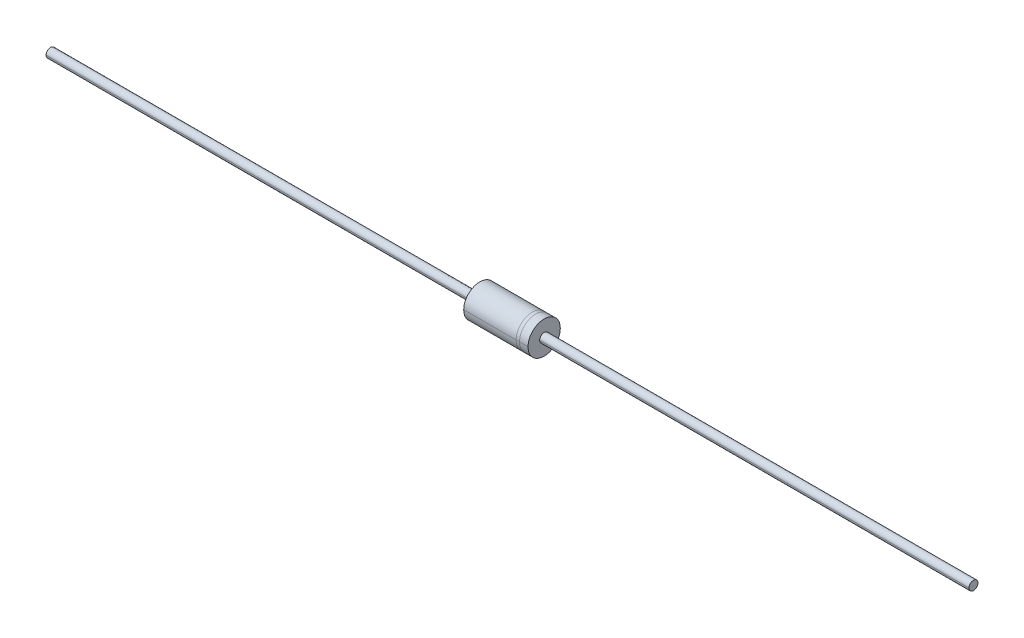
ISO-10303-21;
HEADER;
FILE_DESCRIPTION(('STEP AP214'),'2;1');
FILE_NAME('part.step','',(''),(''),'','','');
FILE_SCHEMA(('AUTOMOTIVE_DESIGN { 1 0 10303 214 1 1 1 1 }'));
ENDSEC;
DATA;
#1=APPLICATION_CONTEXT('core data for automotive mechanical design processes');
#2=APPLICATION_PROTOCOL_DEFINITION('international standard','automotive_design',2000,#1);
#3=PRODUCT_CONTEXT('',#1,'mechanical');
#4=PRODUCT('Part','Part','',(#3));
#5=PRODUCT_RELATED_PRODUCT_CATEGORY('part','',(#4));
#6=PRODUCT_DEFINITION_FORMATION('','',#4);
#7=PRODUCT_DEFINITION_CONTEXT('part definition',#1,'design');
#8=PRODUCT_DEFINITION('design','',#6,#7);
#9=PRODUCT_DEFINITION_SHAPE('','',#8);
#10=(LENGTH_UNIT() NAMED_UNIT(*) SI_UNIT(.MILLI.,.METRE.));
#11=(NAMED_UNIT(*) PLANE_ANGLE_UNIT() SI_UNIT($,.RADIAN.));
#12=(NAMED_UNIT(*) SI_UNIT($,.STERADIAN.) SOLID_ANGLE_UNIT());
#13=UNCERTAINTY_MEASURE_WITH_UNIT(LENGTH_MEASURE(1.E-05),#10,'distance_accuracy_value','');
#14=(GEOMETRIC_REPRESENTATION_CONTEXT(3) GLOBAL_UNCERTAINTY_ASSIGNED_CONTEXT((#13)) GLOBAL_UNIT_ASSIGNED_CONTEXT((#10,
#11,#12)) REPRESENTATION_CONTEXT('',''));
#15=CARTESIAN_POINT('',(0.,0.,0.));
#16=DIRECTION('',(0.,0.,1.));
#17=DIRECTION('',(1.,0.,0.));
#18=AXIS2_PLACEMENT_3D('',#15,#16,#17);
#19=CARTESIAN_POINT('',(1.9025,0.955,0.));
#20=DIRECTION('',(1.,0.,0.));
#21=DIRECTION('',(0.,1.,0.));
#22=AXIS2_PLACEMENT_3D('',#19,#20,#21);
#23=PLANE('',#22);
#24=CARTESIAN_POINT('',(1.9025,0.955,0.));
#25=DIRECTION('',(1.,0.,0.));
#26=DIRECTION('',(0.,0.,-1.));
#27=AXIS2_PLACEMENT_3D('',#24,#25,#26);
#28=CIRCLE('',#27,0.2665);
#29=CARTESIAN_POINT('',(1.9025,0.955,0.2665));
#30=VERTEX_POINT('',#29);
#31=CARTESIAN_POINT('',(1.9025,0.955,-0.2665));
#32=VERTEX_POINT('',#31);
#33=EDGE_CURVE('P0_E11',#30,#32,#28,.T.);
#34=ORIENTED_EDGE('',*,*,#33,.F.);
#35=CARTESIAN_POINT('',(1.9025,0.955,0.));
#36=DIRECTION('',(1.,0.,0.));
#37=DIRECTION('',(0.,0.,-1.));
#38=AXIS2_PLACEMENT_3D('',#35,#36,#37);
#39=CIRCLE('',#38,0.2665);
#40=EDGE_CURVE('P0_E63',#32,#30,#39,.T.);
#41=ORIENTED_EDGE('',*,*,#40,.F.);
#42=EDGE_LOOP('',(#34,#41));
#43=FACE_BOUND('',#42,.T.);
#44=ADVANCED_FACE('P0_F16',(#43),#23,.F.);
#45=CARTESIAN_POINT('',(27.3025,0.955,0.));
#46=DIRECTION('',(1.,0.,0.));
#47=DIRECTION('',(0.,1.,0.));
#48=AXIS2_PLACEMENT_3D('',#45,#46,#47);
#49=PLANE('',#48);
#50=CARTESIAN_POINT('',(27.3025,0.955,0.));
#51=DIRECTION('',(1.,0.,0.));
#52=DIRECTION('',(0.,0.,-1.));
#53=AXIS2_PLACEMENT_3D('',#50,#51,#52);
#54=CIRCLE('',#53,0.2665);
#55=CARTESIAN_POINT('',(27.3025,0.955,0.2665));
#56=VERTEX_POINT('',#55);
#57=CARTESIAN_POINT('',(27.3025,0.955,-0.2665));
#58=VERTEX_POINT('',#57);
#59=EDGE_CURVE('P0_E20',#56,#58,#54,.T.);
#60=ORIENTED_EDGE('',*,*,#59,.T.);
#61=CARTESIAN_POINT('',(27.3025,0.955,0.));
#62=DIRECTION('',(1.,0.,0.));
#63=DIRECTION('',(0.,0.,-1.));
#64=AXIS2_PLACEMENT_3D('',#61,#62,#63);
#65=CIRCLE('',#64,0.2665);
#66=EDGE_CURVE('P0_E54',#58,#56,#65,.T.);
#67=ORIENTED_EDGE('',*,*,#66,.T.);
#68=EDGE_LOOP('',(#60,#67));
#69=FACE_BOUND('',#68,.T.);
#70=ADVANCED_FACE('P0_F18',(#69),#49,.T.);
#71=CARTESIAN_POINT('',(27.3025,0.955,0.));
#72=DIRECTION('',(-1.,0.,0.));
#73=DIRECTION('',(0.,0.,1.));
#74=AXIS2_PLACEMENT_3D('',#71,#72,#73);
#75=CYLINDRICAL_SURFACE('',#74,0.2665);
#76=DIRECTION('',(-1.,0.,0.));
#77=VECTOR('',#76,1.);
#78=CARTESIAN_POINT('',(27.3025,0.955,-0.2665));
#79=LINE('',#78,#77);
#80=EDGE_CURVE('P0_E58',#58,#32,#79,.T.);
#81=ORIENTED_EDGE('',*,*,#80,.F.);
#82=ORIENTED_EDGE('',*,*,#59,.F.);
#83=DIRECTION('',(-1.,0.,0.));
#84=VECTOR('',#83,1.);
#85=CARTESIAN_POINT('',(27.3025,0.955,0.2665));
#86=LINE('',#85,#84);
#87=EDGE_CURVE('P0_E56',#56,#30,#86,.T.);
#88=ORIENTED_EDGE('',*,*,#87,.T.);
#89=ORIENTED_EDGE('',*,*,#33,.T.);
#90=EDGE_LOOP('',(#81,#82,#88,#89));
#91=FACE_BOUND('',#90,.T.);
#92=ADVANCED_FACE('P0_F59',(#91),#75,.T.);
#93=CARTESIAN_POINT('',(27.3025,0.955,0.));
#94=DIRECTION('',(-1.,0.,0.));
#95=DIRECTION('',(0.,0.,1.));
#96=AXIS2_PLACEMENT_3D('',#93,#94,#95);
#97=CYLINDRICAL_SURFACE('',#96,0.2665);
#98=ORIENTED_EDGE('',*,*,#66,.F.);
#99=ORIENTED_EDGE('',*,*,#80,.T.);
#100=ORIENTED_EDGE('',*,*,#40,.T.);
#101=ORIENTED_EDGE('',*,*,#87,.F.);
#102=EDGE_LOOP('',(#98,#99,#100,#101));
#103=FACE_BOUND('',#102,.T.);
#104=ADVANCED_FACE('P0_F65',(#103),#97,.T.);
#105=CLOSED_SHELL('',(#44,#70,#92,#104));
#106=MANIFOLD_SOLID_BREP('P0_B1',#105);
#107=CARTESIAN_POINT('',(-1.9025,0.955,0.));
#108=DIRECTION('',(-1.,0.,0.));
#109=DIRECTION('',(0.,0.,1.));
#110=AXIS2_PLACEMENT_3D('',#107,#108,#109);
#111=PLANE('',#110);
#112=CARTESIAN_POINT('',(-1.9025,0.955,0.));
#113=DIRECTION('',(1.,0.,0.));
#114=DIRECTION('',(0.,0.,-1.));
#115=AXIS2_PLACEMENT_3D('',#112,#113,#114);
#116=CIRCLE('',#115,0.2665);
#117=CARTESIAN_POINT('',(-1.9025,0.955,0.2665));
#118=VERTEX_POINT('',#117);
#119=CARTESIAN_POINT('',(-1.9025,0.955,-0.2665));
#120=VERTEX_POINT('',#119);
#121=EDGE_CURVE('P1_E61',#118,#120,#116,.T.);
#122=ORIENTED_EDGE('',*,*,#121,.T.);
#123=CARTESIAN_POINT('',(-1.9025,0.955,0.));
#124=DIRECTION('',(1.,0.,0.));
#125=DIRECTION('',(0.,0.,-1.));
#126=AXIS2_PLACEMENT_3D('',#123,#124,#125);
#127=CIRCLE('',#126,0.2665);
#128=EDGE_CURVE('P1_E11',#120,#118,#127,.T.);
#129=ORIENTED_EDGE('',*,*,#128,.T.);
#130=EDGE_LOOP('',(#122,#129));
#131=FACE_BOUND('',#130,.T.);
#132=ADVANCED_FACE('P1_F16',(#131),#111,.F.);
#133=CARTESIAN_POINT('',(-27.3025,0.955,0.));
#134=DIRECTION('',(-1.,0.,0.));
#135=DIRECTION('',(0.,0.,1.));
#136=AXIS2_PLACEMENT_3D('',#133,#134,#135);
#137=PLANE('',#136);
#138=CARTESIAN_POINT('',(-27.3025,0.955,0.));
#139=DIRECTION('',(1.,0.,0.));
#140=DIRECTION('',(0.,0.,-1.));
#141=AXIS2_PLACEMENT_3D('',#138,#139,#140);
#142=CIRCLE('',#141,0.2665);
#143=CARTESIAN_POINT('',(-27.3025,0.955,0.2665));
#144=VERTEX_POINT('',#143);
#145=CARTESIAN_POINT('',(-27.3025,0.955,-0.2665));
#146=VERTEX_POINT('',#145);
#147=EDGE_CURVE('P1_E60',#144,#146,#142,.T.);
#148=ORIENTED_EDGE('',*,*,#147,.F.);
#149=CARTESIAN_POINT('',(-27.3025,0.955,0.));
#150=DIRECTION('',(1.,0.,0.));
#151=DIRECTION('',(0.,0.,-1.));
#152=AXIS2_PLACEMENT_3D('',#149,#150,#151);
#153=CIRCLE('',#152,0.2665);
#154=EDGE_CURVE('P1_E26',#146,#144,#153,.T.);
#155=ORIENTED_EDGE('',*,*,#154,.F.);
#156=EDGE_LOOP('',(#148,#155));
#157=FACE_BOUND('',#156,.T.);
#158=ADVANCED_FACE('P1_F63',(#157),#137,.T.);
#159=CARTESIAN_POINT('',(-27.3025,0.955,0.));
#160=DIRECTION('',(1.,0.,0.));
#161=DIRECTION('',(0.,0.,1.));
#162=AXIS2_PLACEMENT_3D('',#159,#160,#161);
#163=CYLINDRICAL_SURFACE('',#162,0.2665);
#164=DIRECTION('',(1.,0.,0.));
#165=VECTOR('',#164,1.);
#166=CARTESIAN_POINT('',(-27.3025,0.955,-0.2665));
#167=LINE('',#166,#165);
#168=EDGE_CURVE('P1_E52',#146,#120,#167,.T.);
#169=ORIENTED_EDGE('',*,*,#168,.F.);
#170=ORIENTED_EDGE('',*,*,#154,.T.);
#171=DIRECTION('',(1.,0.,0.));
#172=VECTOR('',#171,1.);
#173=CARTESIAN_POINT('',(-27.3025,0.955,0.2665));
#174=LINE('',#173,#172);
#175=EDGE_CURVE('P1_E19',#144,#118,#174,.T.);
#176=ORIENTED_EDGE('',*,*,#175,.T.);
#177=ORIENTED_EDGE('',*,*,#128,.F.);
#178=EDGE_LOOP('',(#169,#170,#176,#177));
#179=FACE_BOUND('',#178,.T.);
#180=ADVANCED_FACE('P1_F49',(#179),#163,.T.);
#181=CARTESIAN_POINT('',(-27.3025,0.955,0.));
#182=DIRECTION('',(1.,0.,0.));
#183=DIRECTION('',(0.,0.,1.));
#184=AXIS2_PLACEMENT_3D('',#181,#182,#183);
#185=CYLINDRICAL_SURFACE('',#184,0.2665);
#186=ORIENTED_EDGE('',*,*,#147,.T.);
#187=ORIENTED_EDGE('',*,*,#168,.T.);
#188=ORIENTED_EDGE('',*,*,#121,.F.);
#189=ORIENTED_EDGE('',*,*,#175,.F.);
#190=EDGE_LOOP('',(#186,#187,#188,#189));
#191=FACE_BOUND('',#190,.T.);
#192=ADVANCED_FACE('P1_F59',(#191),#185,.T.);
#193=CLOSED_SHELL('',(#132,#158,#180,#192));
#194=MANIFOLD_SOLID_BREP('P1_B1',#193);
#195=CARTESIAN_POINT('',(1.9025,0.955,0.));
#196=DIRECTION('',(-1.,0.,0.));
#197=DIRECTION('',(0.,0.,1.));
#198=AXIS2_PLACEMENT_3D('',#195,#196,#197);
#199=CYLINDRICAL_SURFACE('',#198,0.955);
#200=DIRECTION('',(-1.,0.,0.));
#201=VECTOR('',#200,1.);
#202=CARTESIAN_POINT('',(1.9025,0.955,-0.955));
#203=LINE('',#202,#201);
#204=CARTESIAN_POINT('',(1.9025,0.955,-0.955));
#205=VERTEX_POINT('',#204);
#206=CARTESIAN_POINT('',(1.4,0.955,-0.955));
#207=VERTEX_POINT('',#206);
#208=EDGE_CURVE('P2_E120',#205,#207,#203,.T.);
#209=ORIENTED_EDGE('',*,*,#208,.F.);
#210=CARTESIAN_POINT('',(1.9025,0.955,0.));
#211=DIRECTION('',(1.,0.,0.));
#212=DIRECTION('',(0.,0.,-1.));
#213=AXIS2_PLACEMENT_3D('',#210,#211,#212);
#214=CIRCLE('',#213,0.955);
#215=CARTESIAN_POINT('',(1.9025,0.955,0.955));
#216=VERTEX_POINT('',#215);
#217=EDGE_CURVE('P2_E11',#216,#205,#214,.T.);
#218=ORIENTED_EDGE('',*,*,#217,.F.);
#219=DIRECTION('',(-1.,0.,0.));
#220=VECTOR('',#219,1.);
#221=CARTESIAN_POINT('',(1.9025,0.955,0.955));
#222=LINE('',#221,#220);
#223=CARTESIAN_POINT('',(1.4,0.955,0.955));
#224=VERTEX_POINT('',#223);
#225=EDGE_CURVE('P2_E126',#216,#224,#222,.T.);
#226=ORIENTED_EDGE('',*,*,#225,.T.);
#227=CARTESIAN_POINT('',(1.4,0.955,0.));
#228=DIRECTION('',(1.,0.,0.));
#229=DIRECTION('',(0.,0.,-1.));
#230=AXIS2_PLACEMENT_3D('',#227,#228,#229);
#231=CIRCLE('',#230,0.955);
#232=EDGE_CURVE('P2_E27',#224,#207,#231,.T.);
#233=ORIENTED_EDGE('',*,*,#232,.T.);
#234=EDGE_LOOP('',(#209,#218,#226,#233));
#235=FACE_BOUND('',#234,.T.);
#236=ADVANCED_FACE('P2_F16',(#235),#199,.T.);
#237=CARTESIAN_POINT('',(1.9025,0.,0.));
#238=DIRECTION('',(1.,0.,0.));
#239=DIRECTION('',(0.,1.,0.));
#240=AXIS2_PLACEMENT_3D('',#237,#238,#239);
#241=PLANE('',#240);
#242=ORIENTED_EDGE('',*,*,#217,.T.);
#243=CARTESIAN_POINT('',(1.9025,0.955,0.));
#244=DIRECTION('',(1.,0.,0.));
#245=DIRECTION('',(0.,0.,-1.));
#246=AXIS2_PLACEMENT_3D('',#243,#244,#245);
#247=CIRCLE('',#246,0.955);
#248=EDGE_CURVE('P2_E118',#205,#216,#247,.T.);
#249=ORIENTED_EDGE('',*,*,#248,.T.);
#250=EDGE_LOOP('',(#242,#249));
#251=FACE_BOUND('',#250,.T.);
#252=ADVANCED_FACE('P2_F161',(#251),#241,.T.);
#253=CARTESIAN_POINT('',(1.2,0.955,0.));
#254=DIRECTION('',(1.,0.,0.));
#255=DIRECTION('',(0.,0.,-1.));
#256=AXIS2_PLACEMENT_3D('',#253,#254,#255);
#257=CYLINDRICAL_SURFACE('',#256,0.905);
#258=DIRECTION('',(1.,0.,0.));
#259=VECTOR('',#258,1.);
#260=CARTESIAN_POINT('',(1.2,0.955,0.905));
#261=LINE('',#260,#259);
#262=CARTESIAN_POINT('',(1.2,0.955,0.905));
#263=VERTEX_POINT('',#262);
#264=CARTESIAN_POINT('',(1.4,0.955,0.905));
#265=VERTEX_POINT('',#264);
#266=EDGE_CURVE('P2_E20',#263,#265,#261,.T.);
#267=ORIENTED_EDGE('',*,*,#266,.F.);
#268=CARTESIAN_POINT('',(1.2,0.955,0.));
#269=DIRECTION('',(1.,0.,0.));
#270=DIRECTION('',(0.,0.,-1.));
#271=AXIS2_PLACEMENT_3D('',#268,#269,#270);
#272=CIRCLE('',#271,0.905);
#273=CARTESIAN_POINT('',(1.2,0.955,-0.905));
#274=VERTEX_POINT('',#273);
#275=EDGE_CURVE('P2_E128',#263,#274,#272,.T.);
#276=ORIENTED_EDGE('',*,*,#275,.T.);
#277=DIRECTION('',(1.,0.,0.));
#278=VECTOR('',#277,1.);
#279=CARTESIAN_POINT('',(1.2,0.955,-0.905));
#280=LINE('',#279,#278);
#281=CARTESIAN_POINT('',(1.4,0.955,-0.905));
#282=VERTEX_POINT('',#281);
#283=EDGE_CURVE('P2_E105',#274,#282,#280,.T.);
#284=ORIENTED_EDGE('',*,*,#283,.T.);
#285=CARTESIAN_POINT('',(1.4,0.955,0.));
#286=DIRECTION('',(1.,0.,0.));
#287=DIRECTION('',(0.,0.,-1.));
#288=AXIS2_PLACEMENT_3D('',#285,#286,#287);
#289=CIRCLE('',#288,0.905);
#290=EDGE_CURVE('P2_E131',#265,#282,#289,.T.);
#291=ORIENTED_EDGE('',*,*,#290,.F.);
#292=EDGE_LOOP('',(#267,#276,#284,#291));
#293=FACE_BOUND('',#292,.T.);
#294=ADVANCED_FACE('P2_F18',(#293),#257,.T.);
#295=CARTESIAN_POINT('',(1.4,0.955,0.));
#296=DIRECTION('',(1.,0.,0.));
#297=DIRECTION('',(0.,1.,0.));
#298=AXIS2_PLACEMENT_3D('',#295,#296,#297);
#299=PLANE('',#298);
#300=ORIENTED_EDGE('',*,*,#232,.F.);
#301=CARTESIAN_POINT('',(1.4,0.955,0.));
#302=DIRECTION('',(1.,0.,0.));
#303=DIRECTION('',(0.,0.,-1.));
#304=AXIS2_PLACEMENT_3D('',#301,#302,#303);
#305=CIRCLE('',#304,0.955);
#306=EDGE_CURVE('P2_E123',#207,#224,#305,.T.);
#307=ORIENTED_EDGE('',*,*,#306,.F.);
#308=EDGE_LOOP('',(#300,#307));
#309=FACE_BOUND('',#308,.T.);
#310=CARTESIAN_POINT('',(1.4,0.955,0.));
#311=DIRECTION('',(1.,0.,0.));
#312=DIRECTION('',(0.,0.,-1.));
#313=AXIS2_PLACEMENT_3D('',#310,#311,#312);
#314=CIRCLE('',#313,0.905);
#315=EDGE_CURVE('P2_E114',#282,#265,#314,.T.);
#316=ORIENTED_EDGE('',*,*,#315,.T.);
#317=ORIENTED_EDGE('',*,*,#290,.T.);
#318=EDGE_LOOP('',(#316,#317));
#319=FACE_BOUND('',#318,.T.);
#320=ADVANCED_FACE('P2_F157',(#309,#319),#299,.F.);
#321=CARTESIAN_POINT('',(1.2,0.955,0.));
#322=DIRECTION('',(1.,0.,0.));
#323=DIRECTION('',(0.,1.,0.));
#324=AXIS2_PLACEMENT_3D('',#321,#322,#323);
#325=PLANE('',#324);
#326=CARTESIAN_POINT('',(1.2,0.955,0.));
#327=DIRECTION('',(1.,0.,0.));
#328=DIRECTION('',(0.,0.,-1.));
#329=AXIS2_PLACEMENT_3D('',#326,#327,#328);
#330=CIRCLE('',#329,0.955);
#331=CARTESIAN_POINT('',(1.2,0.955,0.955));
#332=VERTEX_POINT('',#331);
#333=CARTESIAN_POINT('',(1.2,0.955,-0.955));
#334=VERTEX_POINT('',#333);
#335=EDGE_CURVE('P2_E82',#332,#334,#330,.T.);
#336=ORIENTED_EDGE('',*,*,#335,.T.);
#337=CARTESIAN_POINT('',(1.2,0.955,0.));
#338=DIRECTION('',(1.,0.,0.));
#339=DIRECTION('',(0.,0.,-1.));
#340=AXIS2_PLACEMENT_3D('',#337,#338,#339);
#341=CIRCLE('',#340,0.955);
#342=EDGE_CURVE('P2_E98',#334,#332,#341,.T.);
#343=ORIENTED_EDGE('',*,*,#342,.T.);
#344=EDGE_LOOP('',(#336,#343));
#345=FACE_BOUND('',#344,.T.);
#346=CARTESIAN_POINT('',(1.2,0.955,0.));
#347=DIRECTION('',(1.,0.,0.));
#348=DIRECTION('',(0.,0.,-1.));
#349=AXIS2_PLACEMENT_3D('',#346,#347,#348);
#350=CIRCLE('',#349,0.905);
#351=EDGE_CURVE('P2_E142',#274,#263,#350,.T.);
#352=ORIENTED_EDGE('',*,*,#351,.F.);
#353=ORIENTED_EDGE('',*,*,#275,.F.);
#354=EDGE_LOOP('',(#352,#353));
#355=FACE_BOUND('',#354,.T.);
#356=ADVANCED_FACE('P2_F102',(#345,#355),#325,.T.);
#357=CARTESIAN_POINT('',(-1.9025,0.,0.));
#358=DIRECTION('',(1.,0.,0.));
#359=DIRECTION('',(0.,1.,0.));
#360=AXIS2_PLACEMENT_3D('',#357,#358,#359);
#361=PLANE('',#360);
#362=CARTESIAN_POINT('',(-1.9025,0.955,0.));
#363=DIRECTION('',(1.,0.,0.));
#364=DIRECTION('',(0.,0.,-1.));
#365=AXIS2_PLACEMENT_3D('',#362,#363,#364);
#366=CIRCLE('',#365,0.955);
#367=CARTESIAN_POINT('',(-1.9025,0.955,0.955));
#368=VERTEX_POINT('',#367);
#369=CARTESIAN_POINT('',(-1.9025,0.955,-0.955));
#370=VERTEX_POINT('',#369);
#371=EDGE_CURVE('P2_E40',#368,#370,#366,.T.);
#372=ORIENTED_EDGE('',*,*,#371,.F.);
#373=CARTESIAN_POINT('',(-1.9025,0.955,0.));
#374=DIRECTION('',(1.,0.,0.));
#375=DIRECTION('',(0.,0.,-1.));
#376=AXIS2_PLACEMENT_3D('',#373,#374,#375);
#377=CIRCLE('',#376,0.955);
#378=EDGE_CURVE('P2_E99',#370,#368,#377,.T.);
#379=ORIENTED_EDGE('',*,*,#378,.F.);
#380=EDGE_LOOP('',(#372,#379));
#381=FACE_BOUND('',#380,.T.);
#382=ADVANCED_FACE('P2_F148',(#381),#361,.F.);
#383=CARTESIAN_POINT('',(1.9025,0.955,0.));
#384=DIRECTION('',(-1.,0.,0.));
#385=DIRECTION('',(0.,0.,1.));
#386=AXIS2_PLACEMENT_3D('',#383,#384,#385);
#387=CYLINDRICAL_SURFACE('',#386,0.955);
#388=DIRECTION('',(-1.,0.,0.));
#389=VECTOR('',#388,1.);
#390=CARTESIAN_POINT('',(1.9025,0.955,-0.955));
#391=LINE('',#390,#389);
#392=EDGE_CURVE('P2_E92',#334,#370,#391,.T.);
#393=ORIENTED_EDGE('',*,*,#392,.F.);
#394=ORIENTED_EDGE('',*,*,#335,.F.);
#395=DIRECTION('',(-1.,0.,0.));
#396=VECTOR('',#395,1.);
#397=CARTESIAN_POINT('',(1.9025,0.955,0.955));
#398=LINE('',#397,#396);
#399=EDGE_CURVE('P2_E89',#332,#368,#398,.T.);
#400=ORIENTED_EDGE('',*,*,#399,.T.);
#401=ORIENTED_EDGE('',*,*,#371,.T.);
#402=EDGE_LOOP('',(#393,#394,#400,#401));
#403=FACE_BOUND('',#402,.T.);
#404=ADVANCED_FACE('P2_F88',(#403),#387,.T.);
#405=CARTESIAN_POINT('',(1.9025,0.955,0.));
#406=DIRECTION('',(-1.,0.,0.));
#407=DIRECTION('',(0.,0.,1.));
#408=AXIS2_PLACEMENT_3D('',#405,#406,#407);
#409=CYLINDRICAL_SURFACE('',#408,0.955);
#410=ORIENTED_EDGE('',*,*,#342,.F.);
#411=ORIENTED_EDGE('',*,*,#392,.T.);
#412=ORIENTED_EDGE('',*,*,#378,.T.);
#413=ORIENTED_EDGE('',*,*,#399,.F.);
#414=EDGE_LOOP('',(#410,#411,#412,#413));
#415=FACE_BOUND('',#414,.T.);
#416=ADVANCED_FACE('P2_F97',(#415),#409,.T.);
#417=CARTESIAN_POINT('',(1.2,0.955,0.));
#418=DIRECTION('',(1.,0.,0.));
#419=DIRECTION('',(0.,0.,-1.));
#420=AXIS2_PLACEMENT_3D('',#417,#418,#419);
#421=CYLINDRICAL_SURFACE('',#420,0.905);
#422=ORIENTED_EDGE('',*,*,#351,.T.);
#423=ORIENTED_EDGE('',*,*,#266,.T.);
#424=ORIENTED_EDGE('',*,*,#315,.F.);
#425=ORIENTED_EDGE('',*,*,#283,.F.);
#426=EDGE_LOOP('',(#422,#423,#424,#425));
#427=FACE_BOUND('',#426,.T.);
#428=ADVANCED_FACE('P2_F171',(#427),#421,.T.);
#429=CARTESIAN_POINT('',(1.9025,0.955,0.));
#430=DIRECTION('',(-1.,0.,0.));
#431=DIRECTION('',(0.,0.,1.));
#432=AXIS2_PLACEMENT_3D('',#429,#430,#431);
#433=CYLINDRICAL_SURFACE('',#432,0.955);
#434=ORIENTED_EDGE('',*,*,#248,.F.);
#435=ORIENTED_EDGE('',*,*,#208,.T.);
#436=ORIENTED_EDGE('',*,*,#306,.T.);
#437=ORIENTED_EDGE('',*,*,#225,.F.);
#438=EDGE_LOOP('',(#434,#435,#436,#437));
#439=FACE_BOUND('',#438,.T.);
#440=ADVANCED_FACE('P2_F175',(#439),#433,.T.);
#441=CLOSED_SHELL('',(#236,#252,#294,#320,#356,#382,#404,#416,#428,#440));
#442=MANIFOLD_SOLID_BREP('P2_B1',#441);
#443=CARTESIAN_POINT('',(1.4,0.955,0.));
#444=DIRECTION('',(-1.,0.,0.));
#445=DIRECTION('',(0.,0.,1.));
#446=AXIS2_PLACEMENT_3D('',#443,#444,#445);
#447=CYLINDRICAL_SURFACE('',#446,0.905);
#448=DIRECTION('',(-1.,0.,0.));
#449=VECTOR('',#448,1.);
#450=CARTESIAN_POINT('',(1.4,0.955,-0.905));
#451=LINE('',#450,#449);
#452=CARTESIAN_POINT('',(1.4,0.955,-0.905));
#453=VERTEX_POINT('',#452);
#454=CARTESIAN_POINT('',(1.2,0.955,-0.905));
#455=VERTEX_POINT('',#454);
#456=EDGE_CURVE('P3_E98',#453,#455,#451,.T.);
#457=ORIENTED_EDGE('',*,*,#456,.F.);
#458=CARTESIAN_POINT('',(1.4,0.955,0.));
#459=DIRECTION('',(1.,0.,0.));
#460=DIRECTION('',(0.,0.,-1.));
#461=AXIS2_PLACEMENT_3D('',#458,#459,#460);
#462=CIRCLE('',#461,0.905);
#463=CARTESIAN_POINT('',(1.4,0.955,0.905));
#464=VERTEX_POINT('',#463);
#465=EDGE_CURVE('P3_E72',#453,#464,#462,.T.);
#466=ORIENTED_EDGE('',*,*,#465,.T.);
#467=DIRECTION('',(-1.,0.,0.));
#468=VECTOR('',#467,1.);
#469=CARTESIAN_POINT('',(1.4,0.955,0.905));
#470=LINE('',#469,#468);
#471=CARTESIAN_POINT('',(1.2,0.955,0.905));
#472=VERTEX_POINT('',#471);
#473=EDGE_CURVE('P3_E85',#464,#472,#470,.T.);
#474=ORIENTED_EDGE('',*,*,#473,.T.);
#475=CARTESIAN_POINT('',(1.2,0.955,0.));
#476=DIRECTION('',(1.,0.,0.));
#477=DIRECTION('',(0.,0.,-1.));
#478=AXIS2_PLACEMENT_3D('',#475,#476,#477);
#479=CIRCLE('',#478,0.905);
#480=EDGE_CURVE('P3_E11',#455,#472,#479,.T.);
#481=ORIENTED_EDGE('',*,*,#480,.F.);
#482=EDGE_LOOP('',(#457,#466,#474,#481));
#483=FACE_BOUND('',#482,.T.);
#484=ADVANCED_FACE('P3_F16',(#483),#447,.F.);
#485=CARTESIAN_POINT('',(1.4,0.955,0.));
#486=DIRECTION('',(-1.,0.,0.));
#487=DIRECTION('',(0.,0.,1.));
#488=AXIS2_PLACEMENT_3D('',#485,#486,#487);
#489=CYLINDRICAL_SURFACE('',#488,0.955);
#490=DIRECTION('',(-1.,0.,0.));
#491=VECTOR('',#490,1.);
#492=CARTESIAN_POINT('',(1.4,0.955,-0.955));
#493=LINE('',#492,#491);
#494=CARTESIAN_POINT('',(1.4,0.955,-0.955));
#495=VERTEX_POINT('',#494);
#496=CARTESIAN_POINT('',(1.2,0.955,-0.955));
#497=VERTEX_POINT('',#496);
#498=EDGE_CURVE('P3_E76',#495,#497,#493,.T.);
#499=ORIENTED_EDGE('',*,*,#498,.F.);
#500=CARTESIAN_POINT('',(1.4,0.955,0.));
#501=DIRECTION('',(1.,0.,0.));
#502=DIRECTION('',(0.,0.,-1.));
#503=AXIS2_PLACEMENT_3D('',#500,#501,#502);
#504=CIRCLE('',#503,0.955);
#505=CARTESIAN_POINT('',(1.4,0.955,0.955));
#506=VERTEX_POINT('',#505);
#507=EDGE_CURVE('P3_E64',#506,#495,#504,.T.);
#508=ORIENTED_EDGE('',*,*,#507,.F.);
#509=DIRECTION('',(-1.,0.,0.));
#510=VECTOR('',#509,1.);
#511=CARTESIAN_POINT('',(1.4,0.955,0.955));
#512=LINE('',#511,#510);
#513=CARTESIAN_POINT('',(1.2,0.955,0.955));
#514=VERTEX_POINT('',#513);
#515=EDGE_CURVE('P3_E73',#506,#514,#512,.T.);
#516=ORIENTED_EDGE('',*,*,#515,.T.);
#517=CARTESIAN_POINT('',(1.2,0.955,0.));
#518=DIRECTION('',(1.,0.,0.));
#519=DIRECTION('',(0.,0.,-1.));
#520=AXIS2_PLACEMENT_3D('',#517,#518,#519);
#521=CIRCLE('',#520,0.955);
#522=EDGE_CURVE('P3_E27',#514,#497,#521,.T.);
#523=ORIENTED_EDGE('',*,*,#522,.T.);
#524=EDGE_LOOP('',(#499,#508,#516,#523));
#525=FACE_BOUND('',#524,.T.);
#526=ADVANCED_FACE('P3_F77',(#525),#489,.T.);
#527=CARTESIAN_POINT('',(1.2,0.955,0.));
#528=DIRECTION('',(1.,0.,0.));
#529=DIRECTION('',(0.,1.,0.));
#530=AXIS2_PLACEMENT_3D('',#527,#528,#529);
#531=PLANE('',#530);
#532=CARTESIAN_POINT('',(1.2,0.955,0.));
#533=DIRECTION('',(1.,0.,0.));
#534=DIRECTION('',(0.,0.,-1.));
#535=AXIS2_PLACEMENT_3D('',#532,#533,#534);
#536=CIRCLE('',#535,0.905);
#537=EDGE_CURVE('P3_E20',#472,#455,#536,.T.);
#538=ORIENTED_EDGE('',*,*,#537,.T.);
#539=ORIENTED_EDGE('',*,*,#480,.T.);
#540=EDGE_LOOP('',(#538,#539));
#541=FACE_BOUND('',#540,.T.);
#542=ORIENTED_EDGE('',*,*,#522,.F.);
#543=CARTESIAN_POINT('',(1.2,0.955,0.));
#544=DIRECTION('',(1.,0.,0.));
#545=DIRECTION('',(0.,0.,-1.));
#546=AXIS2_PLACEMENT_3D('',#543,#544,#545);
#547=CIRCLE('',#546,0.955);
#548=EDGE_CURVE('P3_E81',#497,#514,#547,.T.);
#549=ORIENTED_EDGE('',*,*,#548,.F.);
#550=EDGE_LOOP('',(#542,#549));
#551=FACE_BOUND('',#550,.T.);
#552=ADVANCED_FACE('P3_F105',(#541,#551),#531,.F.);
#553=CARTESIAN_POINT('',(1.4,0.955,0.));
#554=DIRECTION('',(1.,0.,0.));
#555=DIRECTION('',(0.,1.,0.));
#556=AXIS2_PLACEMENT_3D('',#553,#554,#555);
#557=PLANE('',#556);
#558=CARTESIAN_POINT('',(1.4,0.955,0.));
#559=DIRECTION('',(1.,0.,0.));
#560=DIRECTION('',(0.,0.,-1.));
#561=AXIS2_PLACEMENT_3D('',#558,#559,#560);
#562=CIRCLE('',#561,0.905);
#563=EDGE_CURVE('P3_E101',#464,#453,#562,.T.);
#564=ORIENTED_EDGE('',*,*,#563,.F.);
#565=ORIENTED_EDGE('',*,*,#465,.F.);
#566=EDGE_LOOP('',(#564,#565));
#567=FACE_BOUND('',#566,.T.);
#568=ORIENTED_EDGE('',*,*,#507,.T.);
#569=CARTESIAN_POINT('',(1.4,0.955,0.));
#570=DIRECTION('',(1.,0.,0.));
#571=DIRECTION('',(0.,0.,-1.));
#572=AXIS2_PLACEMENT_3D('',#569,#570,#571);
#573=CIRCLE('',#572,0.955);
#574=EDGE_CURVE('P3_E68',#495,#506,#573,.T.);
#575=ORIENTED_EDGE('',*,*,#574,.T.);
#576=EDGE_LOOP('',(#568,#575));
#577=FACE_BOUND('',#576,.T.);
#578=ADVANCED_FACE('P3_F66',(#567,#577),#557,.T.);
#579=CARTESIAN_POINT('',(1.4,0.955,0.));
#580=DIRECTION('',(-1.,0.,0.));
#581=DIRECTION('',(0.,0.,1.));
#582=AXIS2_PLACEMENT_3D('',#579,#580,#581);
#583=CYLINDRICAL_SURFACE('',#582,0.955);
#584=ORIENTED_EDGE('',*,*,#574,.F.);
#585=ORIENTED_EDGE('',*,*,#498,.T.);
#586=ORIENTED_EDGE('',*,*,#548,.T.);
#587=ORIENTED_EDGE('',*,*,#515,.F.);
#588=EDGE_LOOP('',(#584,#585,#586,#587));
#589=FACE_BOUND('',#588,.T.);
#590=ADVANCED_FACE('P3_F83',(#589),#583,.T.);
#591=CARTESIAN_POINT('',(1.4,0.955,0.));
#592=DIRECTION('',(-1.,0.,0.));
#593=DIRECTION('',(0.,0.,1.));
#594=AXIS2_PLACEMENT_3D('',#591,#592,#593);
#595=CYLINDRICAL_SURFACE('',#594,0.905);
#596=ORIENTED_EDGE('',*,*,#563,.T.);
#597=ORIENTED_EDGE('',*,*,#456,.T.);
#598=ORIENTED_EDGE('',*,*,#537,.F.);
#599=ORIENTED_EDGE('',*,*,#473,.F.);
#600=EDGE_LOOP('',(#596,#597,#598,#599));
#601=FACE_BOUND('',#600,.T.);
#602=ADVANCED_FACE('P3_F18',(#601),#595,.F.);
#603=CLOSED_SHELL('',(#484,#526,#552,#578,#590,#602));
#604=MANIFOLD_SOLID_BREP('P3_B1',#603);
#605=ADVANCED_BREP_SHAPE_REPRESENTATION('',(#18,#106,#194,#442,#604),#14);
#606=SHAPE_DEFINITION_REPRESENTATION(#9,#605);
ENDSEC;
END-ISO-10303-21;
